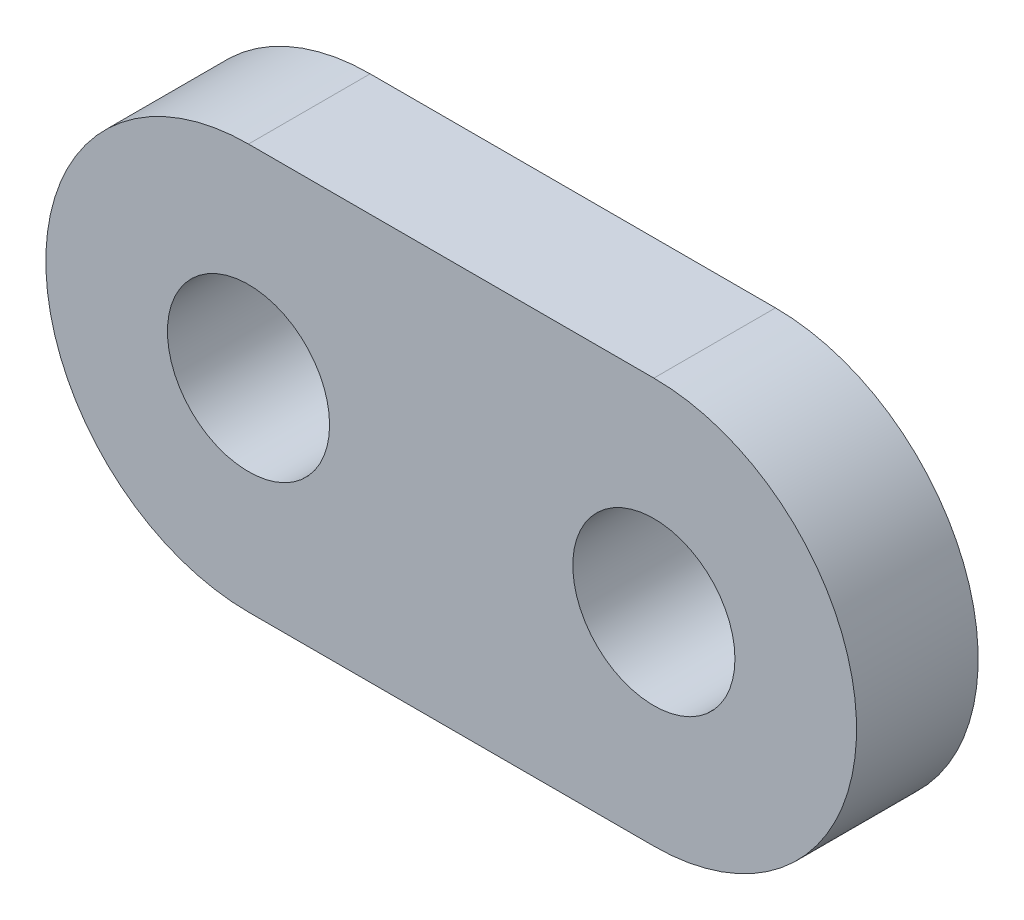
ISO-10303-21;
HEADER;
FILE_DESCRIPTION(('STEP AP214'),'2;1');
FILE_NAME('part.step','',(''),(''),'','','');
FILE_SCHEMA(('AUTOMOTIVE_DESIGN { 1 0 10303 214 1 1 1 1 }'));
ENDSEC;
DATA;
#1=APPLICATION_CONTEXT('core data for automotive mechanical design processes');
#2=APPLICATION_PROTOCOL_DEFINITION('international standard','automotive_design',2000,#1);
#3=PRODUCT_CONTEXT('',#1,'mechanical');
#4=PRODUCT('Part','Part','',(#3));
#5=PRODUCT_RELATED_PRODUCT_CATEGORY('part','',(#4));
#6=PRODUCT_DEFINITION_FORMATION('','',#4);
#7=PRODUCT_DEFINITION_CONTEXT('part definition',#1,'design');
#8=PRODUCT_DEFINITION('design','',#6,#7);
#9=PRODUCT_DEFINITION_SHAPE('','',#8);
#10=(LENGTH_UNIT() NAMED_UNIT(*) SI_UNIT(.MILLI.,.METRE.));
#11=(NAMED_UNIT(*) PLANE_ANGLE_UNIT() SI_UNIT($,.RADIAN.));
#12=(NAMED_UNIT(*) SI_UNIT($,.STERADIAN.) SOLID_ANGLE_UNIT());
#13=UNCERTAINTY_MEASURE_WITH_UNIT(LENGTH_MEASURE(1.E-05),#10,'distance_accuracy_value','');
#14=(GEOMETRIC_REPRESENTATION_CONTEXT(3) GLOBAL_UNCERTAINTY_ASSIGNED_CONTEXT((#13)) GLOBAL_UNIT_ASSIGNED_CONTEXT((#10,
#11,#12)) REPRESENTATION_CONTEXT('',''));
#15=CARTESIAN_POINT('',(0.,0.,0.));
#16=DIRECTION('',(0.,0.,1.));
#17=DIRECTION('',(1.,0.,0.));
#18=AXIS2_PLACEMENT_3D('',#15,#16,#17);
#19=CARTESIAN_POINT('',(-13.4023851460928,0.,3.));
#20=DIRECTION('',(0.,0.,-1.));
#21=DIRECTION('',(-1.,0.,0.));
#22=AXIS2_PLACEMENT_3D('',#19,#20,#21);
#23=PLANE('',#22);
#24=CARTESIAN_POINT('',(-13.4023851460928,0.,3.));
#25=DIRECTION('',(0.,0.,1.));
#26=DIRECTION('',(1.,0.,0.));
#27=AXIS2_PLACEMENT_3D('',#24,#25,#26);
#28=CIRCLE('',#27,2.);
#29=CARTESIAN_POINT('',(-11.4023851460928,0.,3.));
#30=VERTEX_POINT('',#29);
#31=EDGE_CURVE('E98',#30,#30,#28,.T.);
#32=ORIENTED_EDGE('',*,*,#31,.F.);
#33=EDGE_LOOP('',(#32));
#34=FACE_BOUND('',#33,.T.);
#35=CARTESIAN_POINT('',(-13.4023851460928,0.,3.));
#36=DIRECTION('',(0.,0.,1.));
#37=DIRECTION('',(-1.,0.,0.));
#38=AXIS2_PLACEMENT_3D('',#35,#36,#37);
#39=CIRCLE('',#38,5.);
#40=CARTESIAN_POINT('',(-13.4023851460928,5.,3.));
#41=VERTEX_POINT('',#40);
#42=CARTESIAN_POINT('',(-13.4023851460928,-5.,3.));
#43=VERTEX_POINT('',#42);
#44=EDGE_CURVE('E83',#41,#43,#39,.T.);
#45=ORIENTED_EDGE('',*,*,#44,.T.);
#46=DIRECTION('',(1.,0.,0.));
#47=VECTOR('',#46,1.);
#48=CARTESIAN_POINT('',(-13.4023851460928,-5.,3.));
#49=LINE('',#48,#47);
#50=CARTESIAN_POINT('',(-3.40238514609279,-5.,3.));
#51=VERTEX_POINT('',#50);
#52=EDGE_CURVE('E78',#43,#51,#49,.T.);
#53=ORIENTED_EDGE('',*,*,#52,.T.);
#54=CARTESIAN_POINT('',(-3.40238514609279,0.,3.));
#55=DIRECTION('',(0.,0.,1.));
#56=DIRECTION('',(1.,0.,0.));
#57=AXIS2_PLACEMENT_3D('',#54,#55,#56);
#58=CIRCLE('',#57,5.);
#59=CARTESIAN_POINT('',(-3.40238514609279,5.,3.));
#60=VERTEX_POINT('',#59);
#61=EDGE_CURVE('E81',#51,#60,#58,.T.);
#62=ORIENTED_EDGE('',*,*,#61,.T.);
#63=DIRECTION('',(-1.,0.,0.));
#64=VECTOR('',#63,1.);
#65=CARTESIAN_POINT('',(-13.4023851460928,5.,3.));
#66=LINE('',#65,#64);
#67=EDGE_CURVE('E48',#60,#41,#66,.T.);
#68=ORIENTED_EDGE('',*,*,#67,.T.);
#69=EDGE_LOOP('',(#45,#53,#62,#68));
#70=FACE_BOUND('',#69,.T.);
#71=CARTESIAN_POINT('',(-3.40238514609279,0.,3.));
#72=DIRECTION('',(0.,0.,1.));
#73=DIRECTION('',(1.,0.,0.));
#74=AXIS2_PLACEMENT_3D('',#71,#72,#73);
#75=CIRCLE('',#74,2.);
#76=CARTESIAN_POINT('',(-1.40238514609279,0.,3.));
#77=VERTEX_POINT('',#76);
#78=EDGE_CURVE('E113',#77,#77,#75,.T.);
#79=ORIENTED_EDGE('',*,*,#78,.F.);
#80=EDGE_LOOP('',(#79));
#81=FACE_BOUND('',#80,.T.);
#82=ADVANCED_FACE('F31',(#34,#70,#81),#23,.F.);
#83=CARTESIAN_POINT('',(-13.4023851460928,0.,0.));
#84=DIRECTION('',(0.,0.,-1.));
#85=DIRECTION('',(-1.,0.,0.));
#86=AXIS2_PLACEMENT_3D('',#83,#84,#85);
#87=PLANE('',#86);
#88=CARTESIAN_POINT('',(-13.4023851460928,0.,0.));
#89=DIRECTION('',(0.,0.,1.));
#90=DIRECTION('',(1.,0.,0.));
#91=AXIS2_PLACEMENT_3D('',#88,#89,#90);
#92=CIRCLE('',#91,2.);
#93=CARTESIAN_POINT('',(-11.4023851460928,0.,0.));
#94=VERTEX_POINT('',#93);
#95=EDGE_CURVE('E110',#94,#94,#92,.T.);
#96=ORIENTED_EDGE('',*,*,#95,.T.);
#97=EDGE_LOOP('',(#96));
#98=FACE_BOUND('',#97,.T.);
#99=CARTESIAN_POINT('',(-13.4023851460928,0.,0.));
#100=DIRECTION('',(0.,0.,1.));
#101=DIRECTION('',(-1.,0.,0.));
#102=AXIS2_PLACEMENT_3D('',#99,#100,#101);
#103=CIRCLE('',#102,5.);
#104=CARTESIAN_POINT('',(-13.4023851460928,5.,0.));
#105=VERTEX_POINT('',#104);
#106=CARTESIAN_POINT('',(-13.4023851460928,-5.,0.));
#107=VERTEX_POINT('',#106);
#108=EDGE_CURVE('E95',#105,#107,#103,.T.);
#109=ORIENTED_EDGE('',*,*,#108,.F.);
#110=DIRECTION('',(-1.,0.,0.));
#111=VECTOR('',#110,1.);
#112=CARTESIAN_POINT('',(-13.4023851460928,5.,0.));
#113=LINE('',#112,#111);
#114=CARTESIAN_POINT('',(-3.40238514609279,5.,0.));
#115=VERTEX_POINT('',#114);
#116=EDGE_CURVE('E71',#115,#105,#113,.T.);
#117=ORIENTED_EDGE('',*,*,#116,.F.);
#118=CARTESIAN_POINT('',(-3.40238514609279,0.,0.));
#119=DIRECTION('',(0.,0.,1.));
#120=DIRECTION('',(1.,0.,0.));
#121=AXIS2_PLACEMENT_3D('',#118,#119,#120);
#122=CIRCLE('',#121,5.);
#123=CARTESIAN_POINT('',(-3.40238514609279,-5.,0.));
#124=VERTEX_POINT('',#123);
#125=EDGE_CURVE('E65',#124,#115,#122,.T.);
#126=ORIENTED_EDGE('',*,*,#125,.F.);
#127=DIRECTION('',(1.,0.,0.));
#128=VECTOR('',#127,1.);
#129=CARTESIAN_POINT('',(-13.4023851460928,-5.,0.));
#130=LINE('',#129,#128);
#131=EDGE_CURVE('E87',#107,#124,#130,.T.);
#132=ORIENTED_EDGE('',*,*,#131,.F.);
#133=EDGE_LOOP('',(#109,#117,#126,#132));
#134=FACE_BOUND('',#133,.T.);
#135=CARTESIAN_POINT('',(-3.40238514609279,0.,0.));
#136=DIRECTION('',(0.,0.,1.));
#137=DIRECTION('',(1.,0.,0.));
#138=AXIS2_PLACEMENT_3D('',#135,#136,#137);
#139=CIRCLE('',#138,2.);
#140=CARTESIAN_POINT('',(-1.40238514609279,0.,0.));
#141=VERTEX_POINT('',#140);
#142=EDGE_CURVE('E116',#141,#141,#139,.T.);
#143=ORIENTED_EDGE('',*,*,#142,.T.);
#144=EDGE_LOOP('',(#143));
#145=FACE_BOUND('',#144,.T.);
#146=ADVANCED_FACE('F106',(#98,#134,#145),#87,.T.);
#147=CARTESIAN_POINT('',(-13.4023851460928,0.,3.));
#148=DIRECTION('',(0.,0.,-1.));
#149=DIRECTION('',(-1.,0.,0.));
#150=AXIS2_PLACEMENT_3D('',#147,#148,#149);
#151=CYLINDRICAL_SURFACE('',#150,5.);
#152=ORIENTED_EDGE('',*,*,#108,.T.);
#153=DIRECTION('',(0.,0.,-1.));
#154=VECTOR('',#153,1.);
#155=CARTESIAN_POINT('',(-13.4023851460928,-5.,3.));
#156=LINE('',#155,#154);
#157=EDGE_CURVE('E11',#43,#107,#156,.T.);
#158=ORIENTED_EDGE('',*,*,#157,.F.);
#159=ORIENTED_EDGE('',*,*,#44,.F.);
#160=DIRECTION('',(0.,0.,-1.));
#161=VECTOR('',#160,1.);
#162=CARTESIAN_POINT('',(-13.4023851460928,5.,3.));
#163=LINE('',#162,#161);
#164=EDGE_CURVE('E91',#41,#105,#163,.T.);
#165=ORIENTED_EDGE('',*,*,#164,.T.);
#166=EDGE_LOOP('',(#152,#158,#159,#165));
#167=FACE_BOUND('',#166,.T.);
#168=ADVANCED_FACE('F33',(#167),#151,.T.);
#169=CARTESIAN_POINT('',(-13.4023851460928,-5.,3.));
#170=DIRECTION('',(0.,1.,0.));
#171=DIRECTION('',(0.,0.,1.));
#172=AXIS2_PLACEMENT_3D('',#169,#170,#171);
#173=PLANE('',#172);
#174=ORIENTED_EDGE('',*,*,#131,.T.);
#175=DIRECTION('',(0.,0.,-1.));
#176=VECTOR('',#175,1.);
#177=CARTESIAN_POINT('',(-3.40238514609279,-5.,3.));
#178=LINE('',#177,#176);
#179=EDGE_CURVE('E40',#51,#124,#178,.T.);
#180=ORIENTED_EDGE('',*,*,#179,.F.);
#181=ORIENTED_EDGE('',*,*,#52,.F.);
#182=ORIENTED_EDGE('',*,*,#157,.T.);
#183=EDGE_LOOP('',(#174,#180,#181,#182));
#184=FACE_BOUND('',#183,.T.);
#185=ADVANCED_FACE('F86',(#184),#173,.F.);
#186=CARTESIAN_POINT('',(-3.40238514609279,0.,3.));
#187=DIRECTION('',(0.,0.,-1.));
#188=DIRECTION('',(-1.,0.,0.));
#189=AXIS2_PLACEMENT_3D('',#186,#187,#188);
#190=CYLINDRICAL_SURFACE('',#189,5.);
#191=ORIENTED_EDGE('',*,*,#125,.T.);
#192=DIRECTION('',(0.,0.,-1.));
#193=VECTOR('',#192,1.);
#194=CARTESIAN_POINT('',(-3.40238514609279,5.,3.));
#195=LINE('',#194,#193);
#196=EDGE_CURVE('E88',#60,#115,#195,.T.);
#197=ORIENTED_EDGE('',*,*,#196,.F.);
#198=ORIENTED_EDGE('',*,*,#61,.F.);
#199=ORIENTED_EDGE('',*,*,#179,.T.);
#200=EDGE_LOOP('',(#191,#197,#198,#199));
#201=FACE_BOUND('',#200,.T.);
#202=ADVANCED_FACE('F89',(#201),#190,.T.);
#203=CARTESIAN_POINT('',(-13.4023851460928,5.,3.));
#204=DIRECTION('',(0.,-1.,0.));
#205=DIRECTION('',(0.,0.,-1.));
#206=AXIS2_PLACEMENT_3D('',#203,#204,#205);
#207=PLANE('',#206);
#208=ORIENTED_EDGE('',*,*,#116,.T.);
#209=ORIENTED_EDGE('',*,*,#164,.F.);
#210=ORIENTED_EDGE('',*,*,#67,.F.);
#211=ORIENTED_EDGE('',*,*,#196,.T.);
#212=EDGE_LOOP('',(#208,#209,#210,#211));
#213=FACE_BOUND('',#212,.T.);
#214=ADVANCED_FACE('F103',(#213),#207,.F.);
#215=CARTESIAN_POINT('',(-13.4023851460928,0.,3.));
#216=DIRECTION('',(0.,0.,-1.));
#217=DIRECTION('',(-1.,0.,0.));
#218=AXIS2_PLACEMENT_3D('',#215,#216,#217);
#219=CYLINDRICAL_SURFACE('',#218,2.);
#220=ORIENTED_EDGE('',*,*,#31,.T.);
#221=EDGE_LOOP('',(#220));
#222=FACE_BOUND('',#221,.T.);
#223=ORIENTED_EDGE('',*,*,#95,.F.);
#224=EDGE_LOOP('',(#223));
#225=FACE_BOUND('',#224,.T.);
#226=ADVANCED_FACE('F134',(#222,#225),#219,.F.);
#227=CARTESIAN_POINT('',(-3.40238514609279,0.,3.));
#228=DIRECTION('',(0.,0.,-1.));
#229=DIRECTION('',(-1.,0.,0.));
#230=AXIS2_PLACEMENT_3D('',#227,#228,#229);
#231=CYLINDRICAL_SURFACE('',#230,2.);
#232=ORIENTED_EDGE('',*,*,#78,.T.);
#233=EDGE_LOOP('',(#232));
#234=FACE_BOUND('',#233,.T.);
#235=ORIENTED_EDGE('',*,*,#142,.F.);
#236=EDGE_LOOP('',(#235));
#237=FACE_BOUND('',#236,.T.);
#238=ADVANCED_FACE('F122',(#234,#237),#231,.F.);
#239=CLOSED_SHELL('',(#82,#146,#168,#185,#202,#214,#226,#238));
#240=MANIFOLD_SOLID_BREP('B2',#239);
#241=ADVANCED_BREP_SHAPE_REPRESENTATION('',(#18,#240),#14);
#242=SHAPE_DEFINITION_REPRESENTATION(#9,#241);
ENDSEC;
END-ISO-10303-21;
